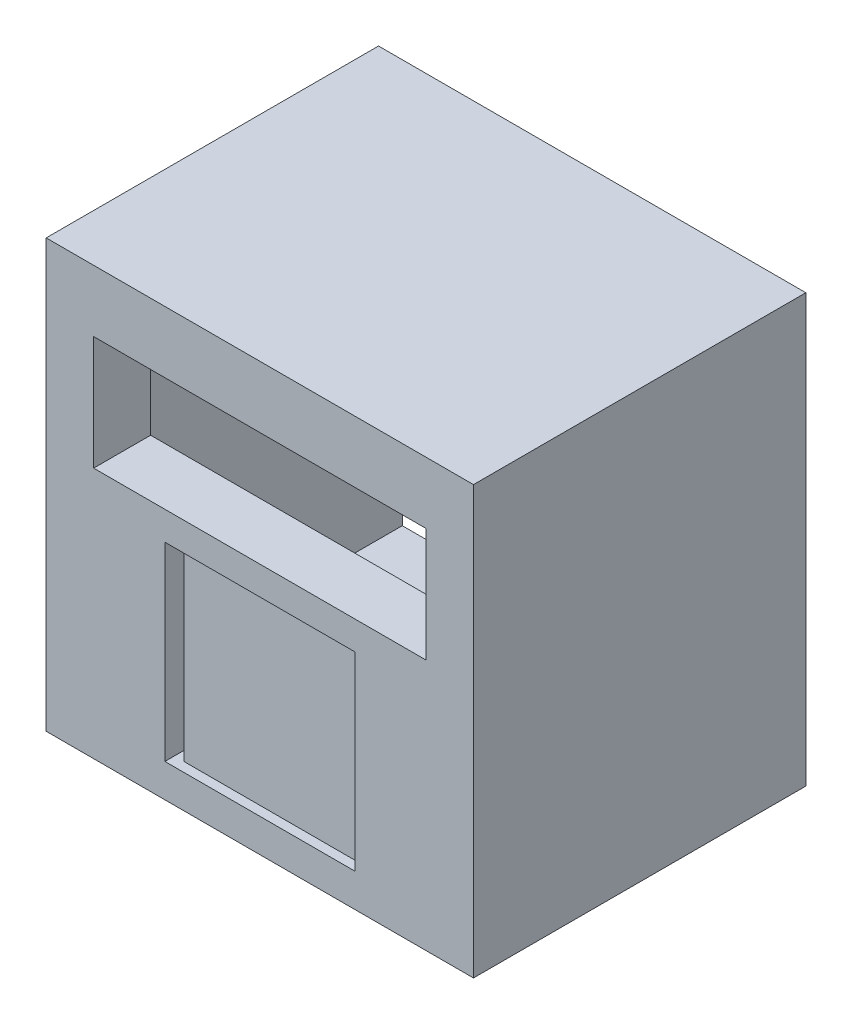
ISO-10303-21;
HEADER;
FILE_DESCRIPTION(('STEP AP214'),'2;1');
FILE_NAME('part.step','',(''),(''),'','','');
FILE_SCHEMA(('AUTOMOTIVE_DESIGN { 1 0 10303 214 1 1 1 1 }'));
ENDSEC;
DATA;
#1=APPLICATION_CONTEXT('core data for automotive mechanical design processes');
#2=APPLICATION_PROTOCOL_DEFINITION('international standard','automotive_design',2000,#1);
#3=PRODUCT_CONTEXT('',#1,'mechanical');
#4=PRODUCT('Part','Part','',(#3));
#5=PRODUCT_RELATED_PRODUCT_CATEGORY('part','',(#4));
#6=PRODUCT_DEFINITION_FORMATION('','',#4);
#7=PRODUCT_DEFINITION_CONTEXT('part definition',#1,'design');
#8=PRODUCT_DEFINITION('design','',#6,#7);
#9=PRODUCT_DEFINITION_SHAPE('','',#8);
#10=(LENGTH_UNIT() NAMED_UNIT(*) SI_UNIT(.MILLI.,.METRE.));
#11=(NAMED_UNIT(*) PLANE_ANGLE_UNIT() SI_UNIT($,.RADIAN.));
#12=(NAMED_UNIT(*) SI_UNIT($,.STERADIAN.) SOLID_ANGLE_UNIT());
#13=UNCERTAINTY_MEASURE_WITH_UNIT(LENGTH_MEASURE(1.E-05),#10,'distance_accuracy_value','');
#14=(GEOMETRIC_REPRESENTATION_CONTEXT(3) GLOBAL_UNCERTAINTY_ASSIGNED_CONTEXT((#13)) GLOBAL_UNIT_ASSIGNED_CONTEXT((#10,
#11,#12)) REPRESENTATION_CONTEXT('',''));
#15=CARTESIAN_POINT('',(0.,0.,0.));
#16=DIRECTION('',(0.,0.,1.));
#17=DIRECTION('',(1.,0.,0.));
#18=AXIS2_PLACEMENT_3D('',#15,#16,#17);
#19=CARTESIAN_POINT('',(0.,0.,68.));
#20=DIRECTION('',(0.,0.,-1.));
#21=DIRECTION('',(-1.,0.,0.));
#22=AXIS2_PLACEMENT_3D('',#19,#20,#21);
#23=PLANE('',#22);
#24=DIRECTION('',(0.,1.,0.));
#25=VECTOR('',#24,1.);
#26=CARTESIAN_POINT('',(-18.,-38.,68.));
#27=LINE('',#26,#25);
#28=CARTESIAN_POINT('',(-18.,-38.,68.));
#29=VERTEX_POINT('',#28);
#30=CARTESIAN_POINT('',(-18.,1.99999999999999,68.));
#31=VERTEX_POINT('',#30);
#32=EDGE_CURVE('E199',#29,#31,#27,.T.);
#33=ORIENTED_EDGE('',*,*,#32,.F.);
#34=DIRECTION('',(1.,0.,0.));
#35=VECTOR('',#34,1.);
#36=CARTESIAN_POINT('',(-20.,-38.,68.));
#37=LINE('',#36,#35);
#38=CARTESIAN_POINT('',(20.,-38.,68.));
#39=VERTEX_POINT('',#38);
#40=EDGE_CURVE('E635',#29,#39,#37,.T.);
#41=ORIENTED_EDGE('',*,*,#40,.T.);
#42=DIRECTION('',(0.,1.,0.));
#43=VECTOR('',#42,1.);
#44=CARTESIAN_POINT('',(20.,-38.,68.));
#45=LINE('',#44,#43);
#46=CARTESIAN_POINT('',(20.,1.99999999999999,68.));
#47=VERTEX_POINT('',#46);
#48=EDGE_CURVE('E629',#39,#47,#45,.T.);
#49=ORIENTED_EDGE('',*,*,#48,.T.);
#50=DIRECTION('',(-1.,0.,0.));
#51=VECTOR('',#50,1.);
#52=CARTESIAN_POINT('',(-20.,1.99999999999999,68.));
#53=LINE('',#52,#51);
#54=EDGE_CURVE('E632',#47,#31,#53,.T.);
#55=ORIENTED_EDGE('',*,*,#54,.T.);
#56=EDGE_LOOP('',(#33,#41,#49,#55));
#57=FACE_BOUND('',#56,.T.);
#58=ADVANCED_FACE('F36',(#57),#23,.F.);
#59=CARTESIAN_POINT('',(40.,-45.,70.));
#60=DIRECTION('',(-1.,0.,0.));
#61=DIRECTION('',(0.,0.,1.));
#62=AXIS2_PLACEMENT_3D('',#59,#60,#61);
#63=PLANE('',#62);
#64=DIRECTION('',(0.,0.,1.));
#65=VECTOR('',#64,1.);
#66=CARTESIAN_POINT('',(40.,38.,58.));
#67=LINE('',#66,#65);
#68=CARTESIAN_POINT('',(40.,38.,58.));
#69=VERTEX_POINT('',#68);
#70=CARTESIAN_POINT('',(40.,38.,65.));
#71=VERTEX_POINT('',#70);
#72=EDGE_CURVE('E233',#69,#71,#67,.T.);
#73=ORIENTED_EDGE('',*,*,#72,.T.);
#74=DIRECTION('',(0.,1.,0.));
#75=VECTOR('',#74,1.);
#76=CARTESIAN_POINT('',(40.,0.,65.));
#77=LINE('',#76,#75);
#78=CARTESIAN_POINT('',(40.,40.,65.));
#79=VERTEX_POINT('',#78);
#80=EDGE_CURVE('E279',#71,#79,#77,.T.);
#81=ORIENTED_EDGE('',*,*,#80,.T.);
#82=DIRECTION('',(0.,0.,-1.));
#83=VECTOR('',#82,1.);
#84=CARTESIAN_POINT('',(40.,40.,70.));
#85=LINE('',#84,#83);
#86=CARTESIAN_POINT('',(40.,40.,0.));
#87=VERTEX_POINT('',#86);
#88=EDGE_CURVE('E270',#79,#87,#85,.T.);
#89=ORIENTED_EDGE('',*,*,#88,.T.);
#90=DIRECTION('',(0.,1.,0.));
#91=VECTOR('',#90,1.);
#92=CARTESIAN_POINT('',(40.,0.,0.));
#93=LINE('',#92,#91);
#94=CARTESIAN_POINT('',(40.,-40.,0.));
#95=VERTEX_POINT('',#94);
#96=EDGE_CURVE('E269',#95,#87,#93,.T.);
#97=ORIENTED_EDGE('',*,*,#96,.F.);
#98=DIRECTION('',(0.,0.,-1.));
#99=VECTOR('',#98,1.);
#100=CARTESIAN_POINT('',(40.,-40.,70.));
#101=LINE('',#100,#99);
#102=CARTESIAN_POINT('',(40.,-40.,65.));
#103=VERTEX_POINT('',#102);
#104=EDGE_CURVE('E280',#103,#95,#101,.T.);
#105=ORIENTED_EDGE('',*,*,#104,.F.);
#106=CARTESIAN_POINT('',(40.,1.99999999999999,65.));
#107=VERTEX_POINT('',#106);
#108=EDGE_CURVE('E275',#103,#107,#77,.T.);
#109=ORIENTED_EDGE('',*,*,#108,.T.);
#110=DIRECTION('',(0.,0.,1.));
#111=VECTOR('',#110,1.);
#112=CARTESIAN_POINT('',(40.,1.99999999999999,58.));
#113=LINE('',#112,#111);
#114=CARTESIAN_POINT('',(40.,1.99999999999999,58.));
#115=VERTEX_POINT('',#114);
#116=EDGE_CURVE('E218',#115,#107,#113,.T.);
#117=ORIENTED_EDGE('',*,*,#116,.F.);
#118=DIRECTION('',(0.,-1.,0.));
#119=VECTOR('',#118,1.);
#120=CARTESIAN_POINT('',(40.,0.,58.));
#121=LINE('',#120,#119);
#122=CARTESIAN_POINT('',(40.,7.99999999999999,58.));
#123=VERTEX_POINT('',#122);
#124=EDGE_CURVE('E654',#123,#115,#121,.T.);
#125=ORIENTED_EDGE('',*,*,#124,.F.);
#126=DIRECTION('',(0.,0.,1.));
#127=VECTOR('',#126,1.);
#128=CARTESIAN_POINT('',(40.,7.99999999999999,58.));
#129=LINE('',#128,#127);
#130=CARTESIAN_POINT('',(40.,7.99999999999999,65.));
#131=VERTEX_POINT('',#130);
#132=EDGE_CURVE('E243',#123,#131,#129,.T.);
#133=ORIENTED_EDGE('',*,*,#132,.T.);
#134=CARTESIAN_POINT('',(40.,32.,65.));
#135=VERTEX_POINT('',#134);
#136=EDGE_CURVE('E278',#131,#135,#77,.T.);
#137=ORIENTED_EDGE('',*,*,#136,.T.);
#138=DIRECTION('',(0.,0.,1.));
#139=VECTOR('',#138,1.);
#140=CARTESIAN_POINT('',(40.,32.,58.));
#141=LINE('',#140,#139);
#142=CARTESIAN_POINT('',(40.,32.,58.));
#143=VERTEX_POINT('',#142);
#144=EDGE_CURVE('E231',#143,#135,#141,.T.);
#145=ORIENTED_EDGE('',*,*,#144,.F.);
#146=EDGE_CURVE('E656',#69,#143,#121,.T.);
#147=ORIENTED_EDGE('',*,*,#146,.F.);
#148=EDGE_LOOP('',(#73,#81,#89,#97,#105,#109,#117,#125,#133,#137,#145,#147));
#149=FACE_BOUND('',#148,.T.);
#150=ADVANCED_FACE('F356',(#149),#63,.T.);
#151=CARTESIAN_POINT('',(-40.,-45.,70.));
#152=DIRECTION('',(1.,0.,0.));
#153=DIRECTION('',(0.,0.,-1.));
#154=AXIS2_PLACEMENT_3D('',#151,#152,#153);
#155=PLANE('',#154);
#156=DIRECTION('',(0.,1.,0.));
#157=VECTOR('',#156,1.);
#158=CARTESIAN_POINT('',(-40.,0.,58.));
#159=LINE('',#158,#157);
#160=CARTESIAN_POINT('',(-40.,1.99999999999999,58.));
#161=VERTEX_POINT('',#160);
#162=CARTESIAN_POINT('',(-40.,38.,58.));
#163=VERTEX_POINT('',#162);
#164=EDGE_CURVE('E620',#161,#163,#159,.T.);
#165=ORIENTED_EDGE('',*,*,#164,.F.);
#166=DIRECTION('',(0.,0.,1.));
#167=VECTOR('',#166,1.);
#168=CARTESIAN_POINT('',(-40.,1.99999999999999,58.));
#169=LINE('',#168,#167);
#170=CARTESIAN_POINT('',(-40.,1.99999999999999,65.));
#171=VERTEX_POINT('',#170);
#172=EDGE_CURVE('E239',#161,#171,#169,.T.);
#173=ORIENTED_EDGE('',*,*,#172,.T.);
#174=DIRECTION('',(0.,-1.,0.));
#175=VECTOR('',#174,1.);
#176=CARTESIAN_POINT('',(-40.,0.,65.));
#177=LINE('',#176,#175);
#178=CARTESIAN_POINT('',(-40.,-40.,65.));
#179=VERTEX_POINT('',#178);
#180=EDGE_CURVE('E287',#171,#179,#177,.T.);
#181=ORIENTED_EDGE('',*,*,#180,.T.);
#182=DIRECTION('',(0.,0.,-1.));
#183=VECTOR('',#182,1.);
#184=CARTESIAN_POINT('',(-40.,-40.,70.));
#185=LINE('',#184,#183);
#186=CARTESIAN_POINT('',(-40.,-40.,0.));
#187=VERTEX_POINT('',#186);
#188=EDGE_CURVE('E282',#179,#187,#185,.T.);
#189=ORIENTED_EDGE('',*,*,#188,.T.);
#190=DIRECTION('',(0.,-1.,0.));
#191=VECTOR('',#190,1.);
#192=CARTESIAN_POINT('',(-40.,0.,0.));
#193=LINE('',#192,#191);
#194=CARTESIAN_POINT('',(-40.,40.,0.));
#195=VERTEX_POINT('',#194);
#196=EDGE_CURVE('E299',#195,#187,#193,.T.);
#197=ORIENTED_EDGE('',*,*,#196,.F.);
#198=DIRECTION('',(0.,0.,-1.));
#199=VECTOR('',#198,1.);
#200=CARTESIAN_POINT('',(-40.,40.,70.));
#201=LINE('',#200,#199);
#202=CARTESIAN_POINT('',(-40.,40.,65.));
#203=VERTEX_POINT('',#202);
#204=EDGE_CURVE('E274',#203,#195,#201,.T.);
#205=ORIENTED_EDGE('',*,*,#204,.F.);
#206=CARTESIAN_POINT('',(-40.,38.,65.));
#207=VERTEX_POINT('',#206);
#208=EDGE_CURVE('E289',#203,#207,#177,.T.);
#209=ORIENTED_EDGE('',*,*,#208,.T.);
#210=DIRECTION('',(0.,0.,1.));
#211=VECTOR('',#210,1.);
#212=CARTESIAN_POINT('',(-40.,38.,58.));
#213=LINE('',#212,#211);
#214=EDGE_CURVE('E237',#163,#207,#213,.T.);
#215=ORIENTED_EDGE('',*,*,#214,.F.);
#216=EDGE_LOOP('',(#165,#173,#181,#189,#197,#205,#209,#215));
#217=FACE_BOUND('',#216,.T.);
#218=ADVANCED_FACE('F362',(#217),#155,.T.);
#219=CARTESIAN_POINT('',(0.,0.,65.));
#220=DIRECTION('',(0.,0.,-1.));
#221=DIRECTION('',(-1.,0.,0.));
#222=AXIS2_PLACEMENT_3D('',#219,#220,#221);
#223=PLANE('',#222);
#224=ORIENTED_EDGE('',*,*,#136,.F.);
#225=DIRECTION('',(1.,0.,0.));
#226=VECTOR('',#225,1.);
#227=CARTESIAN_POINT('',(0.,7.99999999999999,65.));
#228=LINE('',#227,#226);
#229=CARTESIAN_POINT('',(35.,7.99999999999999,65.));
#230=VERTEX_POINT('',#229);
#231=EDGE_CURVE('E225',#230,#131,#228,.T.);
#232=ORIENTED_EDGE('',*,*,#231,.F.);
#233=DIRECTION('',(0.,1.,0.));
#234=VECTOR('',#233,1.);
#235=CARTESIAN_POINT('',(35.,0.,65.));
#236=LINE('',#235,#234);
#237=CARTESIAN_POINT('',(35.,32.,65.));
#238=VERTEX_POINT('',#237);
#239=EDGE_CURVE('E260',#230,#238,#236,.T.);
#240=ORIENTED_EDGE('',*,*,#239,.T.);
#241=DIRECTION('',(-1.,0.,0.));
#242=VECTOR('',#241,1.);
#243=CARTESIAN_POINT('',(0.,32.,65.));
#244=LINE('',#243,#242);
#245=EDGE_CURVE('E223',#135,#238,#244,.T.);
#246=ORIENTED_EDGE('',*,*,#245,.F.);
#247=EDGE_LOOP('',(#224,#232,#240,#246));
#248=FACE_BOUND('',#247,.T.);
#249=ADVANCED_FACE('F413',(#248),#223,.T.);
#250=DIRECTION('',(0.,1.,0.));
#251=VECTOR('',#250,1.);
#252=CARTESIAN_POINT('',(-18.,-38.,65.));
#253=LINE('',#252,#251);
#254=CARTESIAN_POINT('',(-18.,-38.,65.));
#255=VERTEX_POINT('',#254);
#256=CARTESIAN_POINT('',(-18.,1.99999999999999,65.));
#257=VERTEX_POINT('',#256);
#258=EDGE_CURVE('E198',#255,#257,#253,.T.);
#259=ORIENTED_EDGE('',*,*,#258,.T.);
#260=DIRECTION('',(-1.,0.,0.));
#261=VECTOR('',#260,1.);
#262=CARTESIAN_POINT('',(0.,1.99999999999999,65.));
#263=LINE('',#262,#261);
#264=EDGE_CURVE('E209',#107,#257,#263,.T.);
#265=ORIENTED_EDGE('',*,*,#264,.F.);
#266=ORIENTED_EDGE('',*,*,#108,.F.);
#267=DIRECTION('',(1.,0.,0.));
#268=VECTOR('',#267,1.);
#269=CARTESIAN_POINT('',(0.,-40.,65.));
#270=LINE('',#269,#268);
#271=EDGE_CURVE('E283',#179,#103,#270,.T.);
#272=ORIENTED_EDGE('',*,*,#271,.F.);
#273=ORIENTED_EDGE('',*,*,#180,.F.);
#274=CARTESIAN_POINT('',(-20.,1.99999999999999,65.));
#275=VERTEX_POINT('',#274);
#276=EDGE_CURVE('E220',#275,#171,#263,.T.);
#277=ORIENTED_EDGE('',*,*,#276,.F.);
#278=DIRECTION('',(0.,-1.,0.));
#279=VECTOR('',#278,1.);
#280=CARTESIAN_POINT('',(-20.,-38.,65.));
#281=LINE('',#280,#279);
#282=CARTESIAN_POINT('',(-20.,-38.,65.));
#283=VERTEX_POINT('',#282);
#284=EDGE_CURVE('E622',#275,#283,#281,.T.);
#285=ORIENTED_EDGE('',*,*,#284,.T.);
#286=DIRECTION('',(1.,0.,0.));
#287=VECTOR('',#286,1.);
#288=CARTESIAN_POINT('',(-18.,-38.,65.));
#289=LINE('',#288,#287);
#290=EDGE_CURVE('E213',#283,#255,#289,.T.);
#291=ORIENTED_EDGE('',*,*,#290,.T.);
#292=EDGE_LOOP('',(#259,#265,#266,#272,#273,#277,#285,#291));
#293=FACE_BOUND('',#292,.T.);
#294=ADVANCED_FACE('F207',(#293),#223,.T.);
#295=CARTESIAN_POINT('',(0.,0.,0.));
#296=DIRECTION('',(0.,0.,-1.));
#297=DIRECTION('',(-1.,0.,0.));
#298=AXIS2_PLACEMENT_3D('',#295,#296,#297);
#299=PLANE('',#298);
#300=DIRECTION('',(0.,1.,0.));
#301=VECTOR('',#300,1.);
#302=CARTESIAN_POINT('',(45.,-45.,0.));
#303=LINE('',#302,#301);
#304=CARTESIAN_POINT('',(45.,-45.,0.));
#305=VERTEX_POINT('',#304);
#306=CARTESIAN_POINT('',(45.,45.,0.));
#307=VERTEX_POINT('',#306);
#308=EDGE_CURVE('E273',#305,#307,#303,.T.);
#309=ORIENTED_EDGE('',*,*,#308,.F.);
#310=DIRECTION('',(1.,0.,0.));
#311=VECTOR('',#310,1.);
#312=CARTESIAN_POINT('',(-45.,-45.,0.));
#313=LINE('',#312,#311);
#314=CARTESIAN_POINT('',(-45.,-45.,0.));
#315=VERTEX_POINT('',#314);
#316=EDGE_CURVE('E308',#315,#305,#313,.T.);
#317=ORIENTED_EDGE('',*,*,#316,.F.);
#318=DIRECTION('',(0.,-1.,0.));
#319=VECTOR('',#318,1.);
#320=CARTESIAN_POINT('',(-45.,-45.,0.));
#321=LINE('',#320,#319);
#322=CARTESIAN_POINT('',(-45.,45.,0.));
#323=VERTEX_POINT('',#322);
#324=EDGE_CURVE('E319',#323,#315,#321,.T.);
#325=ORIENTED_EDGE('',*,*,#324,.F.);
#326=DIRECTION('',(-1.,0.,0.));
#327=VECTOR('',#326,1.);
#328=CARTESIAN_POINT('',(-45.,45.,0.));
#329=LINE('',#328,#327);
#330=EDGE_CURVE('E317',#307,#323,#329,.T.);
#331=ORIENTED_EDGE('',*,*,#330,.F.);
#332=EDGE_LOOP('',(#309,#317,#325,#331));
#333=FACE_BOUND('',#332,.T.);
#334=DIRECTION('',(1.,0.,0.));
#335=VECTOR('',#334,1.);
#336=CARTESIAN_POINT('',(0.,-40.,0.));
#337=LINE('',#336,#335);
#338=EDGE_CURVE('E296',#187,#95,#337,.T.);
#339=ORIENTED_EDGE('',*,*,#338,.T.);
#340=ORIENTED_EDGE('',*,*,#96,.T.);
#341=DIRECTION('',(-1.,0.,0.));
#342=VECTOR('',#341,1.);
#343=CARTESIAN_POINT('',(0.,40.,0.));
#344=LINE('',#343,#342);
#345=EDGE_CURVE('E295',#87,#195,#344,.T.);
#346=ORIENTED_EDGE('',*,*,#345,.T.);
#347=ORIENTED_EDGE('',*,*,#196,.T.);
#348=EDGE_LOOP('',(#339,#340,#346,#347));
#349=FACE_BOUND('',#348,.T.);
#350=ADVANCED_FACE('F337',(#333,#349),#299,.T.);
#351=CARTESIAN_POINT('',(45.,-45.,70.));
#352=DIRECTION('',(-1.,0.,0.));
#353=DIRECTION('',(0.,0.,1.));
#354=AXIS2_PLACEMENT_3D('',#351,#352,#353);
#355=PLANE('',#354);
#356=ORIENTED_EDGE('',*,*,#308,.T.);
#357=DIRECTION('',(0.,0.,-1.));
#358=VECTOR('',#357,1.);
#359=CARTESIAN_POINT('',(45.,45.,70.));
#360=LINE('',#359,#358);
#361=CARTESIAN_POINT('',(45.,45.,70.));
#362=VERTEX_POINT('',#361);
#363=EDGE_CURVE('E11',#362,#307,#360,.T.);
#364=ORIENTED_EDGE('',*,*,#363,.F.);
#365=DIRECTION('',(0.,1.,0.));
#366=VECTOR('',#365,1.);
#367=CARTESIAN_POINT('',(45.,-45.,70.));
#368=LINE('',#367,#366);
#369=CARTESIAN_POINT('',(45.,-45.,70.));
#370=VERTEX_POINT('',#369);
#371=EDGE_CURVE('E304',#370,#362,#368,.T.);
#372=ORIENTED_EDGE('',*,*,#371,.F.);
#373=DIRECTION('',(0.,0.,-1.));
#374=VECTOR('',#373,1.);
#375=CARTESIAN_POINT('',(45.,-45.,70.));
#376=LINE('',#375,#374);
#377=EDGE_CURVE('E314',#370,#305,#376,.T.);
#378=ORIENTED_EDGE('',*,*,#377,.T.);
#379=EDGE_LOOP('',(#356,#364,#372,#378));
#380=FACE_BOUND('',#379,.T.);
#381=ADVANCED_FACE('F38',(#380),#355,.F.);
#382=CARTESIAN_POINT('',(-45.,45.,70.));
#383=DIRECTION('',(0.,-1.,0.));
#384=DIRECTION('',(0.,0.,-1.));
#385=AXIS2_PLACEMENT_3D('',#382,#383,#384);
#386=PLANE('',#385);
#387=ORIENTED_EDGE('',*,*,#330,.T.);
#388=DIRECTION('',(0.,0.,-1.));
#389=VECTOR('',#388,1.);
#390=CARTESIAN_POINT('',(-45.,45.,70.));
#391=LINE('',#390,#389);
#392=CARTESIAN_POINT('',(-45.,45.,70.));
#393=VERTEX_POINT('',#392);
#394=EDGE_CURVE('E44',#393,#323,#391,.T.);
#395=ORIENTED_EDGE('',*,*,#394,.F.);
#396=DIRECTION('',(-1.,0.,0.));
#397=VECTOR('',#396,1.);
#398=CARTESIAN_POINT('',(-45.,45.,70.));
#399=LINE('',#398,#397);
#400=EDGE_CURVE('E307',#362,#393,#399,.T.);
#401=ORIENTED_EDGE('',*,*,#400,.F.);
#402=ORIENTED_EDGE('',*,*,#363,.T.);
#403=EDGE_LOOP('',(#387,#395,#401,#402));
#404=FACE_BOUND('',#403,.T.);
#405=ADVANCED_FACE('F348',(#404),#386,.F.);
#406=CARTESIAN_POINT('',(-45.,-45.,70.));
#407=DIRECTION('',(1.,0.,0.));
#408=DIRECTION('',(0.,0.,-1.));
#409=AXIS2_PLACEMENT_3D('',#406,#407,#408);
#410=PLANE('',#409);
#411=ORIENTED_EDGE('',*,*,#324,.T.);
#412=DIRECTION('',(0.,0.,-1.));
#413=VECTOR('',#412,1.);
#414=CARTESIAN_POINT('',(-45.,-45.,70.));
#415=LINE('',#414,#413);
#416=CARTESIAN_POINT('',(-45.,-45.,70.));
#417=VERTEX_POINT('',#416);
#418=EDGE_CURVE('E324',#417,#315,#415,.T.);
#419=ORIENTED_EDGE('',*,*,#418,.F.);
#420=DIRECTION('',(0.,-1.,0.));
#421=VECTOR('',#420,1.);
#422=CARTESIAN_POINT('',(-45.,-45.,70.));
#423=LINE('',#422,#421);
#424=EDGE_CURVE('E310',#393,#417,#423,.T.);
#425=ORIENTED_EDGE('',*,*,#424,.F.);
#426=ORIENTED_EDGE('',*,*,#394,.T.);
#427=EDGE_LOOP('',(#411,#419,#425,#426));
#428=FACE_BOUND('',#427,.T.);
#429=ADVANCED_FACE('F331',(#428),#410,.F.);
#430=CARTESIAN_POINT('',(-45.,-45.,70.));
#431=DIRECTION('',(0.,1.,0.));
#432=DIRECTION('',(0.,0.,1.));
#433=AXIS2_PLACEMENT_3D('',#430,#431,#432);
#434=PLANE('',#433);
#435=ORIENTED_EDGE('',*,*,#316,.T.);
#436=ORIENTED_EDGE('',*,*,#377,.F.);
#437=DIRECTION('',(1.,0.,0.));
#438=VECTOR('',#437,1.);
#439=CARTESIAN_POINT('',(-45.,-45.,70.));
#440=LINE('',#439,#438);
#441=EDGE_CURVE('E312',#417,#370,#440,.T.);
#442=ORIENTED_EDGE('',*,*,#441,.F.);
#443=ORIENTED_EDGE('',*,*,#418,.T.);
#444=EDGE_LOOP('',(#435,#436,#442,#443));
#445=FACE_BOUND('',#444,.T.);
#446=ADVANCED_FACE('F341',(#445),#434,.F.);
#447=CARTESIAN_POINT('',(0.,0.,70.));
#448=DIRECTION('',(0.,0.,-1.));
#449=DIRECTION('',(-1.,0.,0.));
#450=AXIS2_PLACEMENT_3D('',#447,#448,#449);
#451=PLANE('',#450);
#452=DIRECTION('',(-1.,0.,0.));
#453=VECTOR('',#452,1.);
#454=CARTESIAN_POINT('',(-20.,1.99999999999999,70.));
#455=LINE('',#454,#453);
#456=CARTESIAN_POINT('',(20.,1.99999999999999,70.));
#457=VERTEX_POINT('',#456);
#458=CARTESIAN_POINT('',(-20.,1.99999999999999,70.));
#459=VERTEX_POINT('',#458);
#460=EDGE_CURVE('E639',#457,#459,#455,.T.);
#461=ORIENTED_EDGE('',*,*,#460,.F.);
#462=DIRECTION('',(0.,1.,0.));
#463=VECTOR('',#462,1.);
#464=CARTESIAN_POINT('',(20.,-38.,70.));
#465=LINE('',#464,#463);
#466=CARTESIAN_POINT('',(20.,-38.,70.));
#467=VERTEX_POINT('',#466);
#468=EDGE_CURVE('E627',#467,#457,#465,.T.);
#469=ORIENTED_EDGE('',*,*,#468,.F.);
#470=DIRECTION('',(1.,0.,0.));
#471=VECTOR('',#470,1.);
#472=CARTESIAN_POINT('',(-20.,-38.,70.));
#473=LINE('',#472,#471);
#474=CARTESIAN_POINT('',(-20.,-38.,70.));
#475=VERTEX_POINT('',#474);
#476=EDGE_CURVE('E633',#475,#467,#473,.T.);
#477=ORIENTED_EDGE('',*,*,#476,.F.);
#478=DIRECTION('',(0.,-1.,0.));
#479=VECTOR('',#478,1.);
#480=CARTESIAN_POINT('',(-20.,-38.,70.));
#481=LINE('',#480,#479);
#482=EDGE_CURVE('E641',#459,#475,#481,.T.);
#483=ORIENTED_EDGE('',*,*,#482,.F.);
#484=EDGE_LOOP('',(#461,#469,#477,#483));
#485=FACE_BOUND('',#484,.T.);
#486=DIRECTION('',(0.,1.,0.));
#487=VECTOR('',#486,1.);
#488=CARTESIAN_POINT('',(35.,0.,70.));
#489=LINE('',#488,#487);
#490=CARTESIAN_POINT('',(35.,7.99999999999999,70.));
#491=VERTEX_POINT('',#490);
#492=CARTESIAN_POINT('',(35.,32.,70.));
#493=VERTEX_POINT('',#492);
#494=EDGE_CURVE('E248',#491,#493,#489,.T.);
#495=ORIENTED_EDGE('',*,*,#494,.F.);
#496=DIRECTION('',(1.,0.,0.));
#497=VECTOR('',#496,1.);
#498=CARTESIAN_POINT('',(0.,7.99999999999999,70.));
#499=LINE('',#498,#497);
#500=CARTESIAN_POINT('',(-35.,7.99999999999999,70.));
#501=VERTEX_POINT('',#500);
#502=EDGE_CURVE('E246',#501,#491,#499,.T.);
#503=ORIENTED_EDGE('',*,*,#502,.F.);
#504=DIRECTION('',(0.,1.,0.));
#505=VECTOR('',#504,1.);
#506=CARTESIAN_POINT('',(-35.,0.,70.));
#507=LINE('',#506,#505);
#508=CARTESIAN_POINT('',(-35.,32.,70.));
#509=VERTEX_POINT('',#508);
#510=EDGE_CURVE('E254',#501,#509,#507,.T.);
#511=ORIENTED_EDGE('',*,*,#510,.T.);
#512=DIRECTION('',(1.,0.,0.));
#513=VECTOR('',#512,1.);
#514=CARTESIAN_POINT('',(0.,32.,70.));
#515=LINE('',#514,#513);
#516=EDGE_CURVE('E251',#509,#493,#515,.T.);
#517=ORIENTED_EDGE('',*,*,#516,.T.);
#518=EDGE_LOOP('',(#495,#503,#511,#517));
#519=FACE_BOUND('',#518,.T.);
#520=ORIENTED_EDGE('',*,*,#371,.T.);
#521=ORIENTED_EDGE('',*,*,#400,.T.);
#522=ORIENTED_EDGE('',*,*,#424,.T.);
#523=ORIENTED_EDGE('',*,*,#441,.T.);
#524=EDGE_LOOP('',(#520,#521,#522,#523));
#525=FACE_BOUND('',#524,.T.);
#526=ADVANCED_FACE('F347',(#485,#519,#525),#451,.F.);
#527=CARTESIAN_POINT('',(-45.,40.,70.));
#528=DIRECTION('',(0.,-1.,0.));
#529=DIRECTION('',(0.,0.,-1.));
#530=AXIS2_PLACEMENT_3D('',#527,#528,#529);
#531=PLANE('',#530);
#532=ORIENTED_EDGE('',*,*,#345,.F.);
#533=ORIENTED_EDGE('',*,*,#88,.F.);
#534=DIRECTION('',(-1.,0.,0.));
#535=VECTOR('',#534,1.);
#536=CARTESIAN_POINT('',(0.,40.,65.));
#537=LINE('',#536,#535);
#538=EDGE_CURVE('E277',#79,#203,#537,.T.);
#539=ORIENTED_EDGE('',*,*,#538,.T.);
#540=ORIENTED_EDGE('',*,*,#204,.T.);
#541=EDGE_LOOP('',(#532,#533,#539,#540));
#542=FACE_BOUND('',#541,.T.);
#543=ADVANCED_FACE('F406',(#542),#531,.T.);
#544=CARTESIAN_POINT('',(-45.,-40.,70.));
#545=DIRECTION('',(0.,1.,0.));
#546=DIRECTION('',(0.,0.,1.));
#547=AXIS2_PLACEMENT_3D('',#544,#545,#546);
#548=PLANE('',#547);
#549=ORIENTED_EDGE('',*,*,#338,.F.);
#550=ORIENTED_EDGE('',*,*,#188,.F.);
#551=ORIENTED_EDGE('',*,*,#271,.T.);
#552=ORIENTED_EDGE('',*,*,#104,.T.);
#553=EDGE_LOOP('',(#549,#550,#551,#552));
#554=FACE_BOUND('',#553,.T.);
#555=ADVANCED_FACE('F409',(#554),#548,.T.);
#556=DIRECTION('',(-1.,0.,0.));
#557=VECTOR('',#556,1.);
#558=CARTESIAN_POINT('',(0.,38.,65.));
#559=LINE('',#558,#557);
#560=EDGE_CURVE('E219',#71,#207,#559,.T.);
#561=ORIENTED_EDGE('',*,*,#560,.T.);
#562=ORIENTED_EDGE('',*,*,#208,.F.);
#563=ORIENTED_EDGE('',*,*,#538,.F.);
#564=ORIENTED_EDGE('',*,*,#80,.F.);
#565=EDGE_LOOP('',(#561,#562,#563,#564));
#566=FACE_BOUND('',#565,.T.);
#567=ADVANCED_FACE('F403',(#566),#223,.T.);
#568=CARTESIAN_POINT('',(0.,7.99999999999999,-0.001000000000001));
#569=DIRECTION('',(0.,-1.,0.));
#570=DIRECTION('',(0.,0.,-1.));
#571=AXIS2_PLACEMENT_3D('',#568,#569,#570);
#572=PLANE('',#571);
#573=DIRECTION('',(0.,0.,1.));
#574=VECTOR('',#573,1.);
#575=CARTESIAN_POINT('',(-35.,7.99999999999999,-0.001000000000001));
#576=LINE('',#575,#574);
#577=CARTESIAN_POINT('',(-35.,7.99999999999999,58.));
#578=VERTEX_POINT('',#577);
#579=EDGE_CURVE('E258',#578,#501,#576,.T.);
#580=ORIENTED_EDGE('',*,*,#579,.T.);
#581=ORIENTED_EDGE('',*,*,#502,.T.);
#582=DIRECTION('',(0.,0.,1.));
#583=VECTOR('',#582,1.);
#584=CARTESIAN_POINT('',(35.,7.99999999999999,-0.001000000000001));
#585=LINE('',#584,#583);
#586=EDGE_CURVE('E257',#230,#491,#585,.T.);
#587=ORIENTED_EDGE('',*,*,#586,.F.);
#588=ORIENTED_EDGE('',*,*,#231,.T.);
#589=ORIENTED_EDGE('',*,*,#132,.F.);
#590=DIRECTION('',(1.,0.,0.));
#591=VECTOR('',#590,1.);
#592=CARTESIAN_POINT('',(0.,7.99999999999999,58.));
#593=LINE('',#592,#591);
#594=EDGE_CURVE('E230',#578,#123,#593,.T.);
#595=ORIENTED_EDGE('',*,*,#594,.F.);
#596=EDGE_LOOP('',(#580,#581,#587,#588,#589,#595));
#597=FACE_BOUND('',#596,.T.);
#598=ADVANCED_FACE('F394',(#597),#572,.F.);
#599=CARTESIAN_POINT('',(-35.,0.,-0.001000000000001));
#600=DIRECTION('',(1.,0.,0.));
#601=DIRECTION('',(0.,0.,-1.));
#602=AXIS2_PLACEMENT_3D('',#599,#600,#601);
#603=PLANE('',#602);
#604=ORIENTED_EDGE('',*,*,#579,.F.);
#605=DIRECTION('',(0.,-1.,0.));
#606=VECTOR('',#605,1.);
#607=CARTESIAN_POINT('',(-35.,0.,58.));
#608=LINE('',#607,#606);
#609=CARTESIAN_POINT('',(-35.,32.,58.));
#610=VERTEX_POINT('',#609);
#611=EDGE_CURVE('E234',#610,#578,#608,.T.);
#612=ORIENTED_EDGE('',*,*,#611,.F.);
#613=DIRECTION('',(0.,0.,1.));
#614=VECTOR('',#613,1.);
#615=CARTESIAN_POINT('',(-35.,32.,-0.001000000000001));
#616=LINE('',#615,#614);
#617=EDGE_CURVE('E261',#610,#509,#616,.T.);
#618=ORIENTED_EDGE('',*,*,#617,.T.);
#619=ORIENTED_EDGE('',*,*,#510,.F.);
#620=EDGE_LOOP('',(#604,#612,#618,#619));
#621=FACE_BOUND('',#620,.T.);
#622=ADVANCED_FACE('F390',(#621),#603,.T.);
#623=CARTESIAN_POINT('',(0.,32.,-0.001000000000001));
#624=DIRECTION('',(0.,-1.,0.));
#625=DIRECTION('',(0.,0.,-1.));
#626=AXIS2_PLACEMENT_3D('',#623,#624,#625);
#627=PLANE('',#626);
#628=ORIENTED_EDGE('',*,*,#617,.F.);
#629=DIRECTION('',(-1.,0.,0.));
#630=VECTOR('',#629,1.);
#631=CARTESIAN_POINT('',(0.,32.,58.));
#632=LINE('',#631,#630);
#633=EDGE_CURVE('E662',#143,#610,#632,.T.);
#634=ORIENTED_EDGE('',*,*,#633,.F.);
#635=ORIENTED_EDGE('',*,*,#144,.T.);
#636=ORIENTED_EDGE('',*,*,#245,.T.);
#637=DIRECTION('',(0.,0.,1.));
#638=VECTOR('',#637,1.);
#639=CARTESIAN_POINT('',(35.,32.,-0.001000000000001));
#640=LINE('',#639,#638);
#641=EDGE_CURVE('E263',#238,#493,#640,.T.);
#642=ORIENTED_EDGE('',*,*,#641,.T.);
#643=ORIENTED_EDGE('',*,*,#516,.F.);
#644=EDGE_LOOP('',(#628,#634,#635,#636,#642,#643));
#645=FACE_BOUND('',#644,.T.);
#646=ADVANCED_FACE('F393',(#645),#627,.T.);
#647=CARTESIAN_POINT('',(35.,0.,-0.001000000000001));
#648=DIRECTION('',(1.,0.,0.));
#649=DIRECTION('',(0.,0.,-1.));
#650=AXIS2_PLACEMENT_3D('',#647,#648,#649);
#651=PLANE('',#650);
#652=ORIENTED_EDGE('',*,*,#586,.T.);
#653=ORIENTED_EDGE('',*,*,#494,.T.);
#654=ORIENTED_EDGE('',*,*,#641,.F.);
#655=ORIENTED_EDGE('',*,*,#239,.F.);
#656=EDGE_LOOP('',(#652,#653,#654,#655));
#657=FACE_BOUND('',#656,.T.);
#658=ADVANCED_FACE('F389',(#657),#651,.F.);
#659=CARTESIAN_POINT('',(0.,1.99999999999999,58.));
#660=DIRECTION('',(0.,1.,0.));
#661=DIRECTION('',(0.,0.,1.));
#662=AXIS2_PLACEMENT_3D('',#659,#660,#661);
#663=PLANE('',#662);
#664=ORIENTED_EDGE('',*,*,#264,.T.);
#665=DIRECTION('',(0.,0.,1.));
#666=VECTOR('',#665,1.);
#667=CARTESIAN_POINT('',(-18.,1.99999999999999,-0.001000000000001));
#668=LINE('',#667,#666);
#669=EDGE_CURVE('E195',#257,#31,#668,.T.);
#670=ORIENTED_EDGE('',*,*,#669,.T.);
#671=ORIENTED_EDGE('',*,*,#54,.F.);
#672=DIRECTION('',(0.,0.,1.));
#673=VECTOR('',#672,1.);
#674=CARTESIAN_POINT('',(20.,1.99999999999999,68.));
#675=LINE('',#674,#673);
#676=EDGE_CURVE('E637',#47,#457,#675,.T.);
#677=ORIENTED_EDGE('',*,*,#676,.T.);
#678=ORIENTED_EDGE('',*,*,#460,.T.);
#679=DIRECTION('',(0.,0.,1.));
#680=VECTOR('',#679,1.);
#681=CARTESIAN_POINT('',(-20.,1.99999999999999,68.));
#682=LINE('',#681,#680);
#683=EDGE_CURVE('E59',#275,#459,#682,.T.);
#684=ORIENTED_EDGE('',*,*,#683,.F.);
#685=ORIENTED_EDGE('',*,*,#276,.T.);
#686=ORIENTED_EDGE('',*,*,#172,.F.);
#687=DIRECTION('',(-1.,0.,0.));
#688=VECTOR('',#687,1.);
#689=CARTESIAN_POINT('',(0.,1.99999999999999,58.));
#690=LINE('',#689,#688);
#691=EDGE_CURVE('E621',#115,#161,#690,.T.);
#692=ORIENTED_EDGE('',*,*,#691,.F.);
#693=ORIENTED_EDGE('',*,*,#116,.T.);
#694=EDGE_LOOP('',(#664,#670,#671,#677,#678,#684,#685,#686,#692,#693));
#695=FACE_BOUND('',#694,.T.);
#696=ADVANCED_FACE('F215',(#695),#663,.F.);
#697=CARTESIAN_POINT('',(0.,38.,58.));
#698=DIRECTION('',(0.,1.,0.));
#699=DIRECTION('',(0.,0.,1.));
#700=AXIS2_PLACEMENT_3D('',#697,#698,#699);
#701=PLANE('',#700);
#702=ORIENTED_EDGE('',*,*,#560,.F.);
#703=ORIENTED_EDGE('',*,*,#72,.F.);
#704=DIRECTION('',(-1.,0.,0.));
#705=VECTOR('',#704,1.);
#706=CARTESIAN_POINT('',(0.,38.,58.));
#707=LINE('',#706,#705);
#708=EDGE_CURVE('E659',#69,#163,#707,.T.);
#709=ORIENTED_EDGE('',*,*,#708,.T.);
#710=ORIENTED_EDGE('',*,*,#214,.T.);
#711=EDGE_LOOP('',(#702,#703,#709,#710));
#712=FACE_BOUND('',#711,.T.);
#713=ADVANCED_FACE('F382',(#712),#701,.T.);
#714=CARTESIAN_POINT('',(0.,0.,58.));
#715=DIRECTION('',(0.,0.,-1.));
#716=DIRECTION('',(-1.,0.,0.));
#717=AXIS2_PLACEMENT_3D('',#714,#715,#716);
#718=PLANE('',#717);
#719=ORIENTED_EDGE('',*,*,#594,.T.);
#720=ORIENTED_EDGE('',*,*,#124,.T.);
#721=ORIENTED_EDGE('',*,*,#691,.T.);
#722=ORIENTED_EDGE('',*,*,#164,.T.);
#723=ORIENTED_EDGE('',*,*,#708,.F.);
#724=ORIENTED_EDGE('',*,*,#146,.T.);
#725=ORIENTED_EDGE('',*,*,#633,.T.);
#726=ORIENTED_EDGE('',*,*,#611,.T.);
#727=EDGE_LOOP('',(#719,#720,#721,#722,#723,#724,#725,#726));
#728=FACE_BOUND('',#727,.T.);
#729=ADVANCED_FACE('F378',(#728),#718,.T.);
#730=CARTESIAN_POINT('',(20.,-38.,68.));
#731=DIRECTION('',(1.,0.,0.));
#732=DIRECTION('',(0.,0.,-1.));
#733=AXIS2_PLACEMENT_3D('',#730,#731,#732);
#734=PLANE('',#733);
#735=ORIENTED_EDGE('',*,*,#468,.T.);
#736=ORIENTED_EDGE('',*,*,#676,.F.);
#737=ORIENTED_EDGE('',*,*,#48,.F.);
#738=DIRECTION('',(0.,0.,1.));
#739=VECTOR('',#738,1.);
#740=CARTESIAN_POINT('',(20.,-38.,68.));
#741=LINE('',#740,#739);
#742=EDGE_CURVE('E646',#39,#467,#741,.T.);
#743=ORIENTED_EDGE('',*,*,#742,.T.);
#744=EDGE_LOOP('',(#735,#736,#737,#743));
#745=FACE_BOUND('',#744,.T.);
#746=ADVANCED_FACE('F371',(#745),#734,.F.);
#747=CARTESIAN_POINT('',(-20.,-38.,68.));
#748=DIRECTION('',(0.,-1.,0.));
#749=DIRECTION('',(0.,0.,-1.));
#750=AXIS2_PLACEMENT_3D('',#747,#748,#749);
#751=PLANE('',#750);
#752=ORIENTED_EDGE('',*,*,#476,.T.);
#753=ORIENTED_EDGE('',*,*,#742,.F.);
#754=ORIENTED_EDGE('',*,*,#40,.F.);
#755=DIRECTION('',(0.,0.,1.));
#756=VECTOR('',#755,1.);
#757=CARTESIAN_POINT('',(-18.,-38.,-0.001000000000001));
#758=LINE('',#757,#756);
#759=EDGE_CURVE('E51',#255,#29,#758,.T.);
#760=ORIENTED_EDGE('',*,*,#759,.F.);
#761=ORIENTED_EDGE('',*,*,#290,.F.);
#762=DIRECTION('',(0.,0.,1.));
#763=VECTOR('',#762,1.);
#764=CARTESIAN_POINT('',(-20.,-38.,68.));
#765=LINE('',#764,#763);
#766=EDGE_CURVE('E648',#283,#475,#765,.T.);
#767=ORIENTED_EDGE('',*,*,#766,.T.);
#768=EDGE_LOOP('',(#752,#753,#754,#760,#761,#767));
#769=FACE_BOUND('',#768,.T.);
#770=ADVANCED_FACE('F367',(#769),#751,.F.);
#771=CARTESIAN_POINT('',(-20.,-38.,68.));
#772=DIRECTION('',(-1.,0.,0.));
#773=DIRECTION('',(0.,0.,1.));
#774=AXIS2_PLACEMENT_3D('',#771,#772,#773);
#775=PLANE('',#774);
#776=ORIENTED_EDGE('',*,*,#482,.T.);
#777=ORIENTED_EDGE('',*,*,#766,.F.);
#778=ORIENTED_EDGE('',*,*,#284,.F.);
#779=ORIENTED_EDGE('',*,*,#683,.T.);
#780=EDGE_LOOP('',(#776,#777,#778,#779));
#781=FACE_BOUND('',#780,.T.);
#782=ADVANCED_FACE('F370',(#781),#775,.F.);
#783=CARTESIAN_POINT('',(-18.,-38.,-0.001000000000001));
#784=DIRECTION('',(1.,0.,0.));
#785=DIRECTION('',(0.,0.,-1.));
#786=AXIS2_PLACEMENT_3D('',#783,#784,#785);
#787=PLANE('',#786);
#788=ORIENTED_EDGE('',*,*,#759,.T.);
#789=ORIENTED_EDGE('',*,*,#32,.T.);
#790=ORIENTED_EDGE('',*,*,#669,.F.);
#791=ORIENTED_EDGE('',*,*,#258,.F.);
#792=EDGE_LOOP('',(#788,#789,#790,#791));
#793=FACE_BOUND('',#792,.T.);
#794=ADVANCED_FACE('F197',(#793),#787,.F.);
#795=CLOSED_SHELL('',(#58,#150,#218,#249,#294,#350,#381,#405,#429,#446,#526,#543,#555,#567,#598,
#622,#646,#658,#696,#713,#729,#746,#770,#782,#794));
#796=MANIFOLD_SOLID_BREP('B2',#795);
#797=ADVANCED_BREP_SHAPE_REPRESENTATION('',(#18,#796),#14);
#798=SHAPE_DEFINITION_REPRESENTATION(#9,#797);
ENDSEC;
END-ISO-10303-21;
